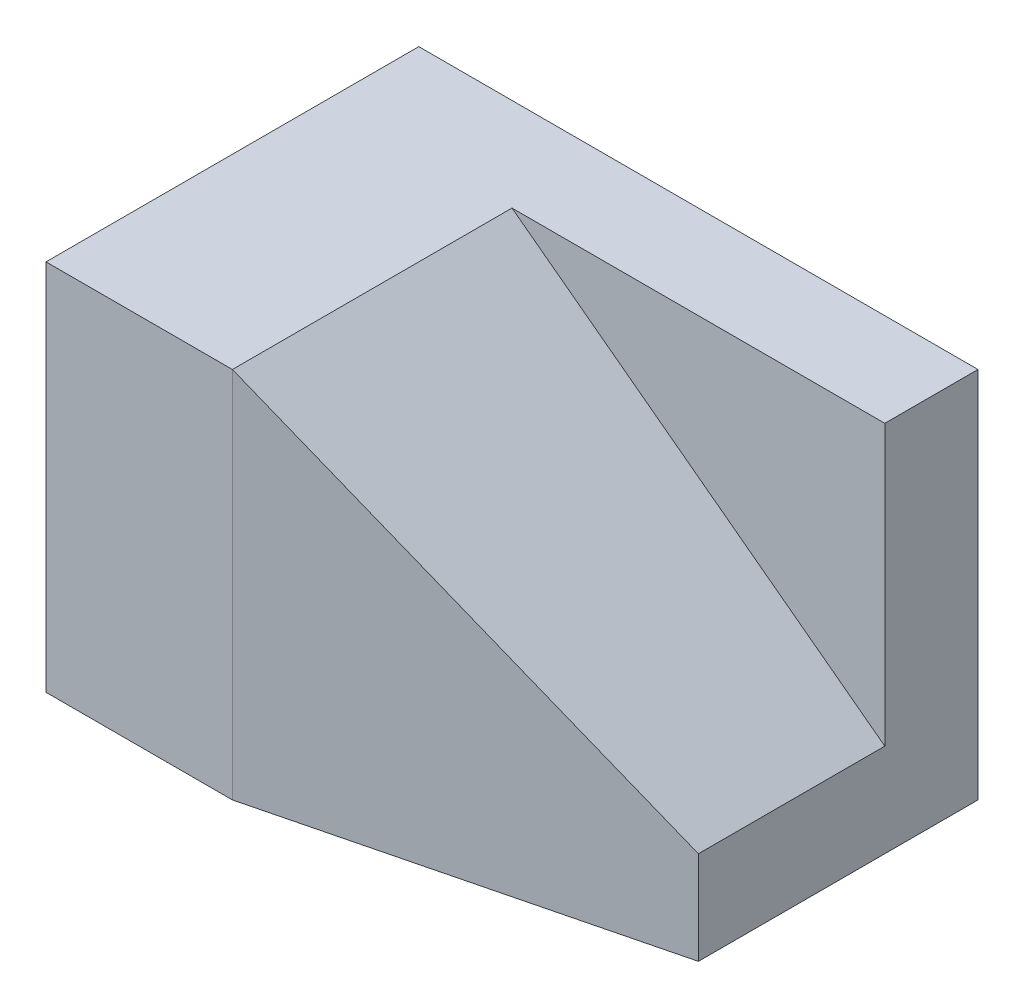
ISO-10303-21;
HEADER;
FILE_DESCRIPTION(('STEP AP214'),'2;1');
FILE_NAME('part.step','',(''),(''),'','','');
FILE_SCHEMA(('AUTOMOTIVE_DESIGN { 1 0 10303 214 1 1 1 1 }'));
ENDSEC;
DATA;
#1=APPLICATION_CONTEXT('core data for automotive mechanical design processes');
#2=APPLICATION_PROTOCOL_DEFINITION('international standard','automotive_design',2000,#1);
#3=PRODUCT_CONTEXT('',#1,'mechanical');
#4=PRODUCT('Part','Part','',(#3));
#5=PRODUCT_RELATED_PRODUCT_CATEGORY('part','',(#4));
#6=PRODUCT_DEFINITION_FORMATION('','',#4);
#7=PRODUCT_DEFINITION_CONTEXT('part definition',#1,'design');
#8=PRODUCT_DEFINITION('design','',#6,#7);
#9=PRODUCT_DEFINITION_SHAPE('','',#8);
#10=(LENGTH_UNIT() NAMED_UNIT(*) SI_UNIT(.MILLI.,.METRE.));
#11=(NAMED_UNIT(*) PLANE_ANGLE_UNIT() SI_UNIT($,.RADIAN.));
#12=(NAMED_UNIT(*) SI_UNIT($,.STERADIAN.) SOLID_ANGLE_UNIT());
#13=UNCERTAINTY_MEASURE_WITH_UNIT(LENGTH_MEASURE(1.E-05),#10,'distance_accuracy_value','');
#14=(GEOMETRIC_REPRESENTATION_CONTEXT(3) GLOBAL_UNCERTAINTY_ASSIGNED_CONTEXT((#13)) GLOBAL_UNIT_ASSIGNED_CONTEXT((#10,
#11,#12)) REPRESENTATION_CONTEXT('',''));
#15=CARTESIAN_POINT('',(0.,0.,0.));
#16=DIRECTION('',(0.,0.,1.));
#17=DIRECTION('',(1.,0.,0.));
#18=AXIS2_PLACEMENT_3D('',#15,#16,#17);
#19=CARTESIAN_POINT('',(-9.63934426229508,40.,-12.6885245901639));
#20=DIRECTION('',(0.,0.,-1.));
#21=DIRECTION('',(-1.,0.,0.));
#22=AXIS2_PLACEMENT_3D('',#19,#20,#21);
#23=PLANE('',#22);
#24=DIRECTION('',(-0.8,0.6,0.));
#25=VECTOR('',#24,1.);
#26=CARTESIAN_POINT('',(30.3606557377049,10.,-12.6885245901639));
#27=LINE('',#26,#25);
#28=CARTESIAN_POINT('',(30.3606557377049,10.,-12.6885245901639));
#29=VERTEX_POINT('',#28);
#30=CARTESIAN_POINT('',(-9.63934426229509,40.,-12.6885245901639));
#31=VERTEX_POINT('',#30);
#32=EDGE_CURVE('E68',#29,#31,#27,.T.);
#33=ORIENTED_EDGE('',*,*,#32,.F.);
#34=DIRECTION('',(0.,-1.,0.));
#35=VECTOR('',#34,1.);
#36=CARTESIAN_POINT('',(30.3606557377049,40.,-12.6885245901639));
#37=LINE('',#36,#35);
#38=CARTESIAN_POINT('',(30.3606557377049,40.,-12.6885245901639));
#39=VERTEX_POINT('',#38);
#40=EDGE_CURVE('E60',#39,#29,#37,.T.);
#41=ORIENTED_EDGE('',*,*,#40,.F.);
#42=DIRECTION('',(1.,0.,0.));
#43=VECTOR('',#42,1.);
#44=CARTESIAN_POINT('',(-9.63934426229508,40.,-12.6885245901639));
#45=LINE('',#44,#43);
#46=EDGE_CURVE('E256',#31,#39,#45,.T.);
#47=ORIENTED_EDGE('',*,*,#46,.F.);
#48=EDGE_LOOP('',(#33,#41,#47));
#49=FACE_BOUND('',#48,.T.);
#50=ADVANCED_FACE('F49',(#49),#23,.F.);
#51=CARTESIAN_POINT('',(-29.6393442622951,40.,17.3114754098361));
#52=DIRECTION('',(0.,0.,-1.));
#53=DIRECTION('',(-1.,0.,0.));
#54=AXIS2_PLACEMENT_3D('',#51,#52,#53);
#55=PLANE('',#54);
#56=DIRECTION('',(1.,0.,0.));
#57=VECTOR('',#56,1.);
#58=CARTESIAN_POINT('',(-29.6393442622951,0.,17.3114754098361));
#59=LINE('',#58,#57);
#60=CARTESIAN_POINT('',(-29.6393442622951,0.,17.3114754098361));
#61=VERTEX_POINT('',#60);
#62=CARTESIAN_POINT('',(-9.63934426229514,0.,17.3114754098361));
#63=VERTEX_POINT('',#62);
#64=EDGE_CURVE('E133',#61,#63,#59,.T.);
#65=ORIENTED_EDGE('',*,*,#64,.T.);
#66=DIRECTION('',(0.,1.,0.));
#67=VECTOR('',#66,1.);
#68=CARTESIAN_POINT('',(-9.63934426229508,0.,17.3114754098361));
#69=LINE('',#68,#67);
#70=CARTESIAN_POINT('',(-9.63934426229508,40.,17.3114754098361));
#71=VERTEX_POINT('',#70);
#72=EDGE_CURVE('E12',#71,#63,#69,.F.);
#73=ORIENTED_EDGE('',*,*,#72,.F.);
#74=DIRECTION('',(1.,0.,0.));
#75=VECTOR('',#74,1.);
#76=CARTESIAN_POINT('',(-29.6393442622951,40.,17.3114754098361));
#77=LINE('',#76,#75);
#78=CARTESIAN_POINT('',(-29.6393442622951,40.,17.3114754098361));
#79=VERTEX_POINT('',#78);
#80=EDGE_CURVE('E86',#79,#71,#77,.T.);
#81=ORIENTED_EDGE('',*,*,#80,.F.);
#82=DIRECTION('',(0.,-1.,0.));
#83=VECTOR('',#82,1.);
#84=CARTESIAN_POINT('',(-29.6393442622951,40.,17.3114754098361));
#85=LINE('',#84,#83);
#86=EDGE_CURVE('E202',#79,#61,#85,.T.);
#87=ORIENTED_EDGE('',*,*,#86,.T.);
#88=EDGE_LOOP('',(#65,#73,#81,#87));
#89=FACE_BOUND('',#88,.T.);
#90=ADVANCED_FACE('F51',(#89),#55,.F.);
#91=CARTESIAN_POINT('',(30.3606557377049,40.,-12.6885245901639));
#92=DIRECTION('',(-1.,0.,0.));
#93=DIRECTION('',(0.,0.,1.));
#94=AXIS2_PLACEMENT_3D('',#91,#92,#93);
#95=PLANE('',#94);
#96=DIRECTION('',(0.,0.,-1.));
#97=VECTOR('',#96,1.);
#98=CARTESIAN_POINT('',(30.3606557377049,0.,-12.6885245901639));
#99=LINE('',#98,#97);
#100=CARTESIAN_POINT('',(30.3606557377049,0.,-12.6885245901639));
#101=VERTEX_POINT('',#100);
#102=CARTESIAN_POINT('',(30.3606557377049,0.,-22.6885245901639));
#103=VERTEX_POINT('',#102);
#104=EDGE_CURVE('E122',#101,#103,#99,.T.);
#105=ORIENTED_EDGE('',*,*,#104,.T.);
#106=DIRECTION('',(0.,-1.,0.));
#107=VECTOR('',#106,1.);
#108=CARTESIAN_POINT('',(30.3606557377049,40.,-22.6885245901639));
#109=LINE('',#108,#107);
#110=CARTESIAN_POINT('',(30.3606557377049,40.,-22.6885245901639));
#111=VERTEX_POINT('',#110);
#112=EDGE_CURVE('E280',#111,#103,#109,.T.);
#113=ORIENTED_EDGE('',*,*,#112,.F.);
#114=DIRECTION('',(0.,0.,-1.));
#115=VECTOR('',#114,1.);
#116=CARTESIAN_POINT('',(30.3606557377049,40.,-12.6885245901639));
#117=LINE('',#116,#115);
#118=EDGE_CURVE('E258',#39,#111,#117,.T.);
#119=ORIENTED_EDGE('',*,*,#118,.F.);
#120=ORIENTED_EDGE('',*,*,#40,.T.);
#121=DIRECTION('',(0.,0.,1.));
#122=VECTOR('',#121,1.);
#123=CARTESIAN_POINT('',(30.3606557377049,10.,-12.6885245901639));
#124=LINE('',#123,#122);
#125=CARTESIAN_POINT('',(30.3606557377049,10.,7.31147540983608));
#126=VERTEX_POINT('',#125);
#127=EDGE_CURVE('E172',#29,#126,#124,.T.);
#128=ORIENTED_EDGE('',*,*,#127,.T.);
#129=DIRECTION('',(0.,-1.,0.));
#130=VECTOR('',#129,1.);
#131=CARTESIAN_POINT('',(30.3606557377049,0.,7.31147540983608));
#132=LINE('',#131,#130);
#133=CARTESIAN_POINT('',(30.3606557377049,0.,7.31147540983608));
#134=VERTEX_POINT('',#133);
#135=EDGE_CURVE('E138',#126,#134,#132,.T.);
#136=ORIENTED_EDGE('',*,*,#135,.T.);
#137=DIRECTION('',(0.,0.,-1.));
#138=VECTOR('',#137,1.);
#139=CARTESIAN_POINT('',(30.3606557377049,0.,-12.6885245901639));
#140=LINE('',#139,#138);
#141=EDGE_CURVE('E127',#134,#101,#140,.T.);
#142=ORIENTED_EDGE('',*,*,#141,.T.);
#143=EDGE_LOOP('',(#105,#113,#119,#120,#128,#136,#142));
#144=FACE_BOUND('',#143,.T.);
#145=ADVANCED_FACE('F136',(#144),#95,.F.);
#146=CARTESIAN_POINT('',(30.3606557377049,40.,-22.6885245901639));
#147=DIRECTION('',(0.,0.,1.));
#148=DIRECTION('',(1.,0.,0.));
#149=AXIS2_PLACEMENT_3D('',#146,#147,#148);
#150=PLANE('',#149);
#151=DIRECTION('',(-1.,0.,0.));
#152=VECTOR('',#151,1.);
#153=CARTESIAN_POINT('',(30.3606557377049,0.,-22.6885245901639));
#154=LINE('',#153,#152);
#155=CARTESIAN_POINT('',(-29.6393442622951,0.,-22.6885245901639));
#156=VERTEX_POINT('',#155);
#157=EDGE_CURVE('E102',#103,#156,#154,.T.);
#158=ORIENTED_EDGE('',*,*,#157,.T.);
#159=DIRECTION('',(0.,-1.,0.));
#160=VECTOR('',#159,1.);
#161=CARTESIAN_POINT('',(-29.6393442622951,40.,-22.6885245901639));
#162=LINE('',#161,#160);
#163=CARTESIAN_POINT('',(-29.6393442622951,40.,-22.6885245901639));
#164=VERTEX_POINT('',#163);
#165=EDGE_CURVE('E277',#164,#156,#162,.T.);
#166=ORIENTED_EDGE('',*,*,#165,.F.);
#167=DIRECTION('',(-1.,0.,0.));
#168=VECTOR('',#167,1.);
#169=CARTESIAN_POINT('',(30.3606557377049,40.,-22.6885245901639));
#170=LINE('',#169,#168);
#171=EDGE_CURVE('E265',#111,#164,#170,.T.);
#172=ORIENTED_EDGE('',*,*,#171,.F.);
#173=ORIENTED_EDGE('',*,*,#112,.T.);
#174=EDGE_LOOP('',(#158,#166,#172,#173));
#175=FACE_BOUND('',#174,.T.);
#176=ADVANCED_FACE('F157',(#175),#150,.F.);
#177=CARTESIAN_POINT('',(-29.6393442622951,40.,-22.6885245901639));
#178=DIRECTION('',(1.,0.,0.));
#179=DIRECTION('',(0.,0.,-1.));
#180=AXIS2_PLACEMENT_3D('',#177,#178,#179);
#181=PLANE('',#180);
#182=DIRECTION('',(0.,0.,1.));
#183=VECTOR('',#182,1.);
#184=CARTESIAN_POINT('',(-29.6393442622951,0.,-22.6885245901639));
#185=LINE('',#184,#183);
#186=EDGE_CURVE('E95',#156,#61,#185,.T.);
#187=ORIENTED_EDGE('',*,*,#186,.T.);
#188=ORIENTED_EDGE('',*,*,#86,.F.);
#189=DIRECTION('',(0.,0.,1.));
#190=VECTOR('',#189,1.);
#191=CARTESIAN_POINT('',(-29.6393442622951,40.,-22.6885245901639));
#192=LINE('',#191,#190);
#193=EDGE_CURVE('E268',#164,#79,#192,.T.);
#194=ORIENTED_EDGE('',*,*,#193,.F.);
#195=ORIENTED_EDGE('',*,*,#165,.T.);
#196=EDGE_LOOP('',(#187,#188,#194,#195));
#197=FACE_BOUND('',#196,.T.);
#198=ADVANCED_FACE('F188',(#197),#181,.F.);
#199=CARTESIAN_POINT('',(0.,40.,0.));
#200=DIRECTION('',(0.,1.,0.));
#201=DIRECTION('',(0.,0.,1.));
#202=AXIS2_PLACEMENT_3D('',#199,#200,#201);
#203=PLANE('',#202);
#204=ORIENTED_EDGE('',*,*,#80,.T.);
#205=DIRECTION('',(0.,0.,1.));
#206=VECTOR('',#205,1.);
#207=CARTESIAN_POINT('',(-9.63934426229508,40.,0.));
#208=LINE('',#207,#206);
#209=EDGE_CURVE('E53',#71,#31,#208,.F.);
#210=ORIENTED_EDGE('',*,*,#209,.T.);
#211=ORIENTED_EDGE('',*,*,#46,.T.);
#212=ORIENTED_EDGE('',*,*,#118,.T.);
#213=ORIENTED_EDGE('',*,*,#171,.T.);
#214=ORIENTED_EDGE('',*,*,#193,.T.);
#215=EDGE_LOOP('',(#204,#210,#211,#212,#213,#214));
#216=FACE_BOUND('',#215,.T.);
#217=ADVANCED_FACE('F186',(#216),#203,.T.);
#218=CARTESIAN_POINT('',(0.,0.,0.));
#219=DIRECTION('',(0.,1.,0.));
#220=DIRECTION('',(0.,0.,1.));
#221=AXIS2_PLACEMENT_3D('',#218,#219,#220);
#222=PLANE('',#221);
#223=ORIENTED_EDGE('',*,*,#64,.F.);
#224=ORIENTED_EDGE('',*,*,#186,.F.);
#225=ORIENTED_EDGE('',*,*,#157,.F.);
#226=ORIENTED_EDGE('',*,*,#104,.F.);
#227=ORIENTED_EDGE('',*,*,#141,.F.);
#228=DIRECTION('',(-0.970142500145332,0.,0.242535625036333));
#229=VECTOR('',#228,1.);
#230=CARTESIAN_POINT('',(30.3606557377049,0.,7.31147540983608));
#231=LINE('',#230,#229);
#232=EDGE_CURVE('E204',#134,#63,#231,.T.);
#233=ORIENTED_EDGE('',*,*,#232,.T.);
#234=EDGE_LOOP('',(#223,#224,#225,#226,#227,#233));
#235=FACE_BOUND('',#234,.T.);
#236=ADVANCED_FACE('F125',(#235),#222,.F.);
#237=CARTESIAN_POINT('',(15.7298360655738,20.9731147540984,0.));
#238=DIRECTION('',(0.6,0.8,0.));
#239=DIRECTION('',(-0.8,0.6,0.));
#240=AXIS2_PLACEMENT_3D('',#237,#238,#239);
#241=PLANE('',#240);
#242=ORIENTED_EDGE('',*,*,#32,.T.);
#243=ORIENTED_EDGE('',*,*,#209,.F.);
#244=DIRECTION('',(-0.784464540552736,0.588348405414552,0.196116135138184));
#245=VECTOR('',#244,1.);
#246=CARTESIAN_POINT('',(30.3606557377049,10.,7.31147540983608));
#247=LINE('',#246,#245);
#248=EDGE_CURVE('E209',#126,#71,#247,.T.);
#249=ORIENTED_EDGE('',*,*,#248,.F.);
#250=ORIENTED_EDGE('',*,*,#127,.F.);
#251=EDGE_LOOP('',(#242,#243,#249,#250));
#252=FACE_BOUND('',#251,.T.);
#253=ADVANCED_FACE('F185',(#252),#241,.T.);
#254=CARTESIAN_POINT('',(3.50626808100289,0.,14.0250723240116));
#255=DIRECTION('',(0.242535625036333,0.,0.970142500145332));
#256=DIRECTION('',(0.970142500145332,0.,-0.242535625036333));
#257=AXIS2_PLACEMENT_3D('',#254,#255,#256);
#258=PLANE('',#257);
#259=ORIENTED_EDGE('',*,*,#248,.T.);
#260=ORIENTED_EDGE('',*,*,#72,.T.);
#261=ORIENTED_EDGE('',*,*,#232,.F.);
#262=ORIENTED_EDGE('',*,*,#135,.F.);
#263=EDGE_LOOP('',(#259,#260,#261,#262));
#264=FACE_BOUND('',#263,.T.);
#265=ADVANCED_FACE('F207',(#264),#258,.T.);
#266=CLOSED_SHELL('',(#50,#90,#145,#176,#198,#217,#236,#253,#265));
#267=MANIFOLD_SOLID_BREP('B2',#266);
#268=ADVANCED_BREP_SHAPE_REPRESENTATION('',(#18,#267),#14);
#269=SHAPE_DEFINITION_REPRESENTATION(#9,#268);
ENDSEC;
END-ISO-10303-21;
